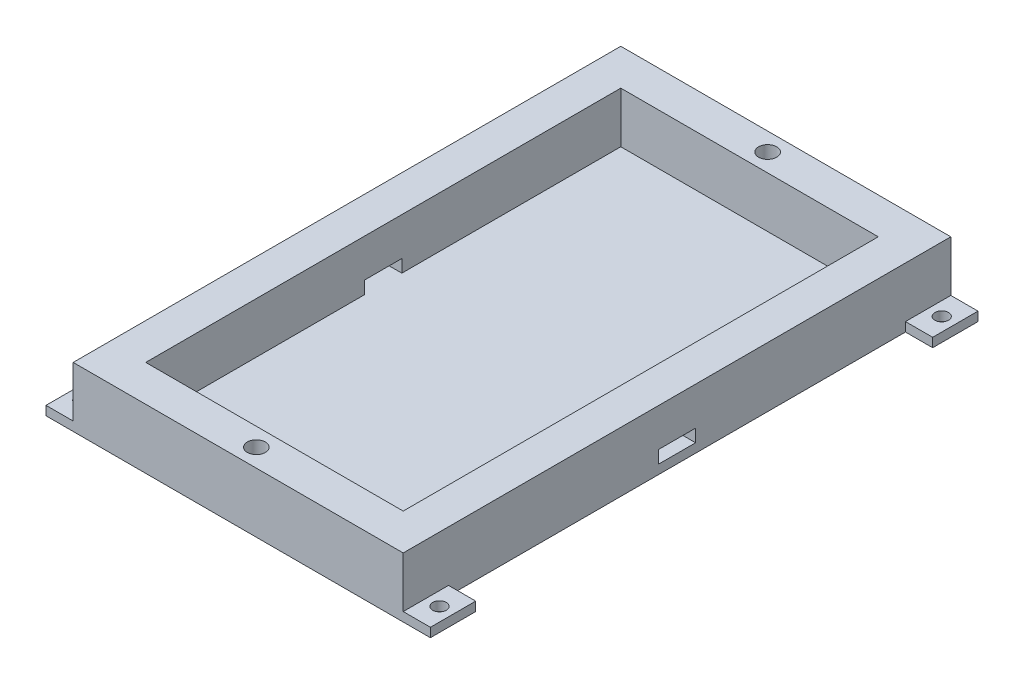
ISO-10303-21;
HEADER;
FILE_DESCRIPTION(('STEP AP214'),'2;1');
FILE_NAME('part.step','',(''),(''),'','','');
FILE_SCHEMA(('AUTOMOTIVE_DESIGN { 1 0 10303 214 1 1 1 1 }'));
ENDSEC;
DATA;
#1=APPLICATION_CONTEXT('core data for automotive mechanical design processes');
#2=APPLICATION_PROTOCOL_DEFINITION('international standard','automotive_design',2000,#1);
#3=PRODUCT_CONTEXT('',#1,'mechanical');
#4=PRODUCT('Part','Part','',(#3));
#5=PRODUCT_RELATED_PRODUCT_CATEGORY('part','',(#4));
#6=PRODUCT_DEFINITION_FORMATION('','',#4);
#7=PRODUCT_DEFINITION_CONTEXT('part definition',#1,'design');
#8=PRODUCT_DEFINITION('design','',#6,#7);
#9=PRODUCT_DEFINITION_SHAPE('','',#8);
#10=(LENGTH_UNIT() NAMED_UNIT(*) SI_UNIT(.MILLI.,.METRE.));
#11=(NAMED_UNIT(*) PLANE_ANGLE_UNIT() SI_UNIT($,.RADIAN.));
#12=(NAMED_UNIT(*) SI_UNIT($,.STERADIAN.) SOLID_ANGLE_UNIT());
#13=UNCERTAINTY_MEASURE_WITH_UNIT(LENGTH_MEASURE(1.E-05),#10,'distance_accuracy_value','');
#14=(GEOMETRIC_REPRESENTATION_CONTEXT(3) GLOBAL_UNCERTAINTY_ASSIGNED_CONTEXT((#13)) GLOBAL_UNIT_ASSIGNED_CONTEXT((#10,
#11,#12)) REPRESENTATION_CONTEXT('',''));
#15=CARTESIAN_POINT('',(0.,0.,0.));
#16=DIRECTION('',(0.,0.,1.));
#17=DIRECTION('',(1.,0.,0.));
#18=AXIS2_PLACEMENT_3D('',#15,#16,#17);
#19=CARTESIAN_POINT('',(18.2,6.6,-30.2));
#20=DIRECTION('',(-1.,0.,0.));
#21=DIRECTION('',(0.,0.,1.));
#22=AXIS2_PLACEMENT_3D('',#19,#20,#21);
#23=PLANE('',#22);
#24=DIRECTION('',(0.,0.,1.));
#25=VECTOR('',#24,1.);
#26=CARTESIAN_POINT('',(18.2,2.4,-2.05));
#27=LINE('',#26,#25);
#28=CARTESIAN_POINT('',(18.2,2.4,-2.05));
#29=VERTEX_POINT('',#28);
#30=CARTESIAN_POINT('',(18.2,2.4,2.05));
#31=VERTEX_POINT('',#30);
#32=EDGE_CURVE('E331',#29,#31,#27,.T.);
#33=ORIENTED_EDGE('',*,*,#32,.F.);
#34=DIRECTION('',(0.,1.,0.));
#35=VECTOR('',#34,1.);
#36=CARTESIAN_POINT('',(18.2,1.,-2.05));
#37=LINE('',#36,#35);
#38=CARTESIAN_POINT('',(18.2,1.,-2.05));
#39=VERTEX_POINT('',#38);
#40=EDGE_CURVE('E329',#39,#29,#37,.T.);
#41=ORIENTED_EDGE('',*,*,#40,.F.);
#42=DIRECTION('',(0.,0.,-1.));
#43=VECTOR('',#42,1.);
#44=CARTESIAN_POINT('',(18.2,1.,-2.05));
#45=LINE('',#44,#43);
#46=CARTESIAN_POINT('',(18.2,1.,2.05));
#47=VERTEX_POINT('',#46);
#48=EDGE_CURVE('E337',#47,#39,#45,.T.);
#49=ORIENTED_EDGE('',*,*,#48,.F.);
#50=DIRECTION('',(0.,-1.,0.));
#51=VECTOR('',#50,1.);
#52=CARTESIAN_POINT('',(18.2,1.,2.05));
#53=LINE('',#52,#51);
#54=EDGE_CURVE('E334',#31,#47,#53,.T.);
#55=ORIENTED_EDGE('',*,*,#54,.F.);
#56=EDGE_LOOP('',(#33,#41,#49,#55));
#57=FACE_BOUND('',#56,.T.);
#58=DIRECTION('',(0.,-1.,0.));
#59=VECTOR('',#58,1.);
#60=CARTESIAN_POINT('',(18.2,1.,-25.2));
#61=LINE('',#60,#59);
#62=CARTESIAN_POINT('',(18.2,1.,-25.2));
#63=VERTEX_POINT('',#62);
#64=CARTESIAN_POINT('',(18.2,0.,-25.2));
#65=VERTEX_POINT('',#64);
#66=EDGE_CURVE('E224',#63,#65,#61,.T.);
#67=ORIENTED_EDGE('',*,*,#66,.F.);
#68=DIRECTION('',(0.,0.,1.));
#69=VECTOR('',#68,1.);
#70=CARTESIAN_POINT('',(18.2,1.,-30.2));
#71=LINE('',#70,#69);
#72=CARTESIAN_POINT('',(18.2,1.,-30.2));
#73=VERTEX_POINT('',#72);
#74=EDGE_CURVE('E231',#73,#63,#71,.T.);
#75=ORIENTED_EDGE('',*,*,#74,.F.);
#76=DIRECTION('',(0.,-1.,0.));
#77=VECTOR('',#76,1.);
#78=CARTESIAN_POINT('',(18.2,6.6,-30.2));
#79=LINE('',#78,#77);
#80=CARTESIAN_POINT('',(18.2,6.6,-30.2));
#81=VERTEX_POINT('',#80);
#82=EDGE_CURVE('E40',#81,#73,#79,.T.);
#83=ORIENTED_EDGE('',*,*,#82,.F.);
#84=DIRECTION('',(0.,0.,-1.));
#85=VECTOR('',#84,1.);
#86=CARTESIAN_POINT('',(18.2,6.6,-30.2));
#87=LINE('',#86,#85);
#88=CARTESIAN_POINT('',(18.2,6.6,30.2));
#89=VERTEX_POINT('',#88);
#90=EDGE_CURVE('E411',#89,#81,#87,.T.);
#91=ORIENTED_EDGE('',*,*,#90,.F.);
#92=DIRECTION('',(0.,-1.,0.));
#93=VECTOR('',#92,1.);
#94=CARTESIAN_POINT('',(18.2,6.6,30.2));
#95=LINE('',#94,#93);
#96=CARTESIAN_POINT('',(18.2,1.,30.2));
#97=VERTEX_POINT('',#96);
#98=EDGE_CURVE('E421',#89,#97,#95,.T.);
#99=ORIENTED_EDGE('',*,*,#98,.T.);
#100=DIRECTION('',(0.,0.,1.));
#101=VECTOR('',#100,1.);
#102=CARTESIAN_POINT('',(18.2,1.,30.2));
#103=LINE('',#102,#101);
#104=CARTESIAN_POINT('',(18.2,1.,25.2));
#105=VERTEX_POINT('',#104);
#106=EDGE_CURVE('E257',#105,#97,#103,.T.);
#107=ORIENTED_EDGE('',*,*,#106,.F.);
#108=DIRECTION('',(0.,-1.,0.));
#109=VECTOR('',#108,1.);
#110=CARTESIAN_POINT('',(18.2,1.,25.2));
#111=LINE('',#110,#109);
#112=CARTESIAN_POINT('',(18.2,0.,25.2));
#113=VERTEX_POINT('',#112);
#114=EDGE_CURVE('E266',#105,#113,#111,.T.);
#115=ORIENTED_EDGE('',*,*,#114,.T.);
#116=DIRECTION('',(0.,0.,-1.));
#117=VECTOR('',#116,1.);
#118=CARTESIAN_POINT('',(18.2,0.,-30.2));
#119=LINE('',#118,#117);
#120=EDGE_CURVE('E244',#113,#65,#119,.T.);
#121=ORIENTED_EDGE('',*,*,#120,.T.);
#122=EDGE_LOOP('',(#67,#75,#83,#91,#99,#107,#115,#121));
#123=FACE_BOUND('',#122,.T.);
#124=ADVANCED_FACE('F33',(#57,#123),#23,.F.);
#125=CARTESIAN_POINT('',(-18.2,6.6,-30.2));
#126=DIRECTION('',(1.,0.,0.));
#127=DIRECTION('',(0.,0.,-1.));
#128=AXIS2_PLACEMENT_3D('',#125,#126,#127);
#129=PLANE('',#128);
#130=DIRECTION('',(0.,0.,-1.));
#131=VECTOR('',#130,1.);
#132=CARTESIAN_POINT('',(-18.2,1.,-30.2));
#133=LINE('',#132,#131);
#134=CARTESIAN_POINT('',(-18.2,1.,2.05));
#135=VERTEX_POINT('',#134);
#136=CARTESIAN_POINT('',(-18.2,1.,-2.05));
#137=VERTEX_POINT('',#136);
#138=EDGE_CURVE('E374',#135,#137,#133,.T.);
#139=ORIENTED_EDGE('',*,*,#138,.T.);
#140=DIRECTION('',(0.,1.,0.));
#141=VECTOR('',#140,1.);
#142=CARTESIAN_POINT('',(-18.2,6.59999999999997,-2.04999999999999));
#143=LINE('',#142,#141);
#144=CARTESIAN_POINT('',(-18.2,2.4,-2.05));
#145=VERTEX_POINT('',#144);
#146=EDGE_CURVE('E366',#137,#145,#143,.T.);
#147=ORIENTED_EDGE('',*,*,#146,.T.);
#148=DIRECTION('',(0.,0.,1.));
#149=VECTOR('',#148,1.);
#150=CARTESIAN_POINT('',(-18.2,2.40000000000001,-30.2));
#151=LINE('',#150,#149);
#152=CARTESIAN_POINT('',(-18.2,2.4,2.05));
#153=VERTEX_POINT('',#152);
#154=EDGE_CURVE('E371',#145,#153,#151,.T.);
#155=ORIENTED_EDGE('',*,*,#154,.T.);
#156=DIRECTION('',(0.,-1.,0.));
#157=VECTOR('',#156,1.);
#158=CARTESIAN_POINT('',(-18.2,6.59999999999998,2.05));
#159=LINE('',#158,#157);
#160=EDGE_CURVE('E358',#153,#135,#159,.T.);
#161=ORIENTED_EDGE('',*,*,#160,.T.);
#162=EDGE_LOOP('',(#139,#147,#155,#161));
#163=FACE_BOUND('',#162,.T.);
#164=DIRECTION('',(0.,-1.,0.));
#165=VECTOR('',#164,1.);
#166=CARTESIAN_POINT('',(-18.2,1.,25.2));
#167=LINE('',#166,#165);
#168=CARTESIAN_POINT('',(-18.2,1.,25.2));
#169=VERTEX_POINT('',#168);
#170=CARTESIAN_POINT('',(-18.2,0.,25.2));
#171=VERTEX_POINT('',#170);
#172=EDGE_CURVE('E301',#169,#171,#167,.T.);
#173=ORIENTED_EDGE('',*,*,#172,.F.);
#174=DIRECTION('',(0.,0.,-1.));
#175=VECTOR('',#174,1.);
#176=CARTESIAN_POINT('',(-18.2,1.,30.2));
#177=LINE('',#176,#175);
#178=CARTESIAN_POINT('',(-18.2,1.,30.2));
#179=VERTEX_POINT('',#178);
#180=EDGE_CURVE('E282',#179,#169,#177,.T.);
#181=ORIENTED_EDGE('',*,*,#180,.F.);
#182=DIRECTION('',(0.,-1.,0.));
#183=VECTOR('',#182,1.);
#184=CARTESIAN_POINT('',(-18.2,6.6,30.2));
#185=LINE('',#184,#183);
#186=CARTESIAN_POINT('',(-18.2,6.6,30.2));
#187=VERTEX_POINT('',#186);
#188=EDGE_CURVE('E431',#187,#179,#185,.T.);
#189=ORIENTED_EDGE('',*,*,#188,.F.);
#190=DIRECTION('',(0.,0.,1.));
#191=VECTOR('',#190,1.);
#192=CARTESIAN_POINT('',(-18.2,6.6,-30.2));
#193=LINE('',#192,#191);
#194=CARTESIAN_POINT('',(-18.2,6.6,-30.2));
#195=VERTEX_POINT('',#194);
#196=EDGE_CURVE('E417',#195,#187,#193,.T.);
#197=ORIENTED_EDGE('',*,*,#196,.F.);
#198=DIRECTION('',(0.,-1.,0.));
#199=VECTOR('',#198,1.);
#200=CARTESIAN_POINT('',(-18.2,6.6,-30.2));
#201=LINE('',#200,#199);
#202=CARTESIAN_POINT('',(-18.2,1.,-30.2));
#203=VERTEX_POINT('',#202);
#204=EDGE_CURVE('E434',#195,#203,#201,.T.);
#205=ORIENTED_EDGE('',*,*,#204,.T.);
#206=DIRECTION('',(0.,0.,-1.));
#207=VECTOR('',#206,1.);
#208=CARTESIAN_POINT('',(-18.2,1.,-30.2));
#209=LINE('',#208,#207);
#210=CARTESIAN_POINT('',(-18.2,1.,-25.2));
#211=VERTEX_POINT('',#210);
#212=EDGE_CURVE('E311',#211,#203,#209,.T.);
#213=ORIENTED_EDGE('',*,*,#212,.F.);
#214=DIRECTION('',(0.,-1.,0.));
#215=VECTOR('',#214,1.);
#216=CARTESIAN_POINT('',(-18.2,1.,-25.2));
#217=LINE('',#216,#215);
#218=CARTESIAN_POINT('',(-18.2,0.,-25.2));
#219=VERTEX_POINT('',#218);
#220=EDGE_CURVE('E320',#211,#219,#217,.T.);
#221=ORIENTED_EDGE('',*,*,#220,.T.);
#222=DIRECTION('',(0.,0.,1.));
#223=VECTOR('',#222,1.);
#224=CARTESIAN_POINT('',(-18.2,0.,-30.2));
#225=LINE('',#224,#223);
#226=EDGE_CURVE('E425',#219,#171,#225,.T.);
#227=ORIENTED_EDGE('',*,*,#226,.T.);
#228=EDGE_LOOP('',(#173,#181,#189,#197,#205,#213,#221,#227));
#229=FACE_BOUND('',#228,.T.);
#230=ADVANCED_FACE('F500',(#163,#229),#129,.F.);
#231=CARTESIAN_POINT('',(0.,6.6,0.));
#232=DIRECTION('',(0.,1.,0.));
#233=DIRECTION('',(0.,0.,1.));
#234=AXIS2_PLACEMENT_3D('',#231,#232,#233);
#235=PLANE('',#234);
#236=CARTESIAN_POINT('',(0.,6.6,-28.2));
#237=DIRECTION('',(0.,1.,0.));
#238=DIRECTION('',(0.,0.,1.));
#239=AXIS2_PLACEMENT_3D('',#236,#237,#238);
#240=CIRCLE('',#239,1.);
#241=CARTESIAN_POINT('',(0.,6.6,-27.2));
#242=VERTEX_POINT('',#241);
#243=EDGE_CURVE('E483',#242,#242,#240,.T.);
#244=ORIENTED_EDGE('',*,*,#243,.F.);
#245=EDGE_LOOP('',(#244));
#246=FACE_BOUND('',#245,.T.);
#247=CARTESIAN_POINT('',(0.,6.6,28.2));
#248=DIRECTION('',(0.,1.,0.));
#249=DIRECTION('',(0.,0.,1.));
#250=AXIS2_PLACEMENT_3D('',#247,#248,#249);
#251=CIRCLE('',#250,1.);
#252=CARTESIAN_POINT('',(0.,6.6,29.2));
#253=VERTEX_POINT('',#252);
#254=EDGE_CURVE('E477',#253,#253,#251,.T.);
#255=ORIENTED_EDGE('',*,*,#254,.F.);
#256=EDGE_LOOP('',(#255));
#257=FACE_BOUND('',#256,.T.);
#258=ORIENTED_EDGE('',*,*,#90,.T.);
#259=DIRECTION('',(-1.,0.,0.));
#260=VECTOR('',#259,1.);
#261=CARTESIAN_POINT('',(-18.2,6.6,-30.2));
#262=LINE('',#261,#260);
#263=EDGE_CURVE('E414',#81,#195,#262,.T.);
#264=ORIENTED_EDGE('',*,*,#263,.T.);
#265=ORIENTED_EDGE('',*,*,#196,.T.);
#266=DIRECTION('',(1.,0.,0.));
#267=VECTOR('',#266,1.);
#268=CARTESIAN_POINT('',(-18.2,6.6,30.2));
#269=LINE('',#268,#267);
#270=EDGE_CURVE('E419',#187,#89,#269,.T.);
#271=ORIENTED_EDGE('',*,*,#270,.T.);
#272=EDGE_LOOP('',(#258,#264,#265,#271));
#273=FACE_BOUND('',#272,.T.);
#274=DIRECTION('',(-1.,0.,0.));
#275=VECTOR('',#274,1.);
#276=CARTESIAN_POINT('',(-14.2,6.6,-26.2));
#277=LINE('',#276,#275);
#278=CARTESIAN_POINT('',(14.2,6.6,-26.2));
#279=VERTEX_POINT('',#278);
#280=CARTESIAN_POINT('',(-14.2,6.6,-26.2));
#281=VERTEX_POINT('',#280);
#282=EDGE_CURVE('E393',#279,#281,#277,.T.);
#283=ORIENTED_EDGE('',*,*,#282,.F.);
#284=DIRECTION('',(0.,0.,-1.));
#285=VECTOR('',#284,1.);
#286=CARTESIAN_POINT('',(14.2,6.6,-26.2));
#287=LINE('',#286,#285);
#288=CARTESIAN_POINT('',(14.2,6.6,26.2));
#289=VERTEX_POINT('',#288);
#290=EDGE_CURVE('E391',#289,#279,#287,.T.);
#291=ORIENTED_EDGE('',*,*,#290,.F.);
#292=DIRECTION('',(1.,0.,0.));
#293=VECTOR('',#292,1.);
#294=CARTESIAN_POINT('',(-14.2,6.6,26.2));
#295=LINE('',#294,#293);
#296=CARTESIAN_POINT('',(-14.2,6.6,26.2));
#297=VERTEX_POINT('',#296);
#298=EDGE_CURVE('E398',#297,#289,#295,.T.);
#299=ORIENTED_EDGE('',*,*,#298,.F.);
#300=DIRECTION('',(0.,0.,1.));
#301=VECTOR('',#300,1.);
#302=CARTESIAN_POINT('',(-14.2,6.6,-26.2));
#303=LINE('',#302,#301);
#304=EDGE_CURVE('E395',#281,#297,#303,.T.);
#305=ORIENTED_EDGE('',*,*,#304,.F.);
#306=EDGE_LOOP('',(#283,#291,#299,#305));
#307=FACE_BOUND('',#306,.T.);
#308=ADVANCED_FACE('F444',(#246,#257,#273,#307),#235,.T.);
#309=CARTESIAN_POINT('',(0.,0.,0.));
#310=DIRECTION('',(0.,1.,0.));
#311=DIRECTION('',(0.,0.,1.));
#312=AXIS2_PLACEMENT_3D('',#309,#310,#311);
#313=PLANE('',#312);
#314=ORIENTED_EDGE('',*,*,#120,.F.);
#315=DIRECTION('',(-1.,0.,0.));
#316=VECTOR('',#315,1.);
#317=CARTESIAN_POINT('',(18.2,0.,25.2));
#318=LINE('',#317,#316);
#319=CARTESIAN_POINT('',(21.2,0.,25.2));
#320=VERTEX_POINT('',#319);
#321=EDGE_CURVE('E47',#320,#113,#318,.T.);
#322=ORIENTED_EDGE('',*,*,#321,.F.);
#323=DIRECTION('',(0.,0.,-1.));
#324=VECTOR('',#323,1.);
#325=CARTESIAN_POINT('',(21.2,0.,30.2));
#326=LINE('',#325,#324);
#327=CARTESIAN_POINT('',(21.2,0.,30.2));
#328=VERTEX_POINT('',#327);
#329=EDGE_CURVE('E255',#328,#320,#326,.T.);
#330=ORIENTED_EDGE('',*,*,#329,.F.);
#331=DIRECTION('',(1.,0.,0.));
#332=VECTOR('',#331,1.);
#333=CARTESIAN_POINT('',(-18.2,0.,30.2));
#334=LINE('',#333,#332);
#335=CARTESIAN_POINT('',(-21.2,0.,30.2));
#336=VERTEX_POINT('',#335);
#337=EDGE_CURVE('E415',#336,#328,#334,.T.);
#338=ORIENTED_EDGE('',*,*,#337,.F.);
#339=DIRECTION('',(0.,0.,1.));
#340=VECTOR('',#339,1.);
#341=CARTESIAN_POINT('',(-21.2,0.,30.2));
#342=LINE('',#341,#340);
#343=CARTESIAN_POINT('',(-21.2,0.,25.2));
#344=VERTEX_POINT('',#343);
#345=EDGE_CURVE('E286',#344,#336,#342,.T.);
#346=ORIENTED_EDGE('',*,*,#345,.F.);
#347=DIRECTION('',(-1.,0.,0.));
#348=VECTOR('',#347,1.);
#349=CARTESIAN_POINT('',(-18.2,0.,25.2));
#350=LINE('',#349,#348);
#351=EDGE_CURVE('E279',#171,#344,#350,.T.);
#352=ORIENTED_EDGE('',*,*,#351,.F.);
#353=ORIENTED_EDGE('',*,*,#226,.F.);
#354=DIRECTION('',(1.,0.,0.));
#355=VECTOR('',#354,1.);
#356=CARTESIAN_POINT('',(-18.2,0.,-25.2));
#357=LINE('',#356,#355);
#358=CARTESIAN_POINT('',(-21.2,0.,-25.2));
#359=VERTEX_POINT('',#358);
#360=EDGE_CURVE('E55',#359,#219,#357,.T.);
#361=ORIENTED_EDGE('',*,*,#360,.F.);
#362=DIRECTION('',(0.,0.,1.));
#363=VECTOR('',#362,1.);
#364=CARTESIAN_POINT('',(-21.2,0.,-30.2));
#365=LINE('',#364,#363);
#366=CARTESIAN_POINT('',(-21.2,0.,-30.2));
#367=VERTEX_POINT('',#366);
#368=EDGE_CURVE('E308',#367,#359,#365,.T.);
#369=ORIENTED_EDGE('',*,*,#368,.F.);
#370=DIRECTION('',(-1.,0.,0.));
#371=VECTOR('',#370,1.);
#372=CARTESIAN_POINT('',(-18.2,0.,-30.2));
#373=LINE('',#372,#371);
#374=CARTESIAN_POINT('',(21.2,0.,-30.2));
#375=VERTEX_POINT('',#374);
#376=EDGE_CURVE('E423',#375,#367,#373,.T.);
#377=ORIENTED_EDGE('',*,*,#376,.F.);
#378=DIRECTION('',(0.,0.,-1.));
#379=VECTOR('',#378,1.);
#380=CARTESIAN_POINT('',(21.2,0.,-30.2));
#381=LINE('',#380,#379);
#382=CARTESIAN_POINT('',(21.2,0.,-25.2));
#383=VERTEX_POINT('',#382);
#384=EDGE_CURVE('E241',#383,#375,#381,.T.);
#385=ORIENTED_EDGE('',*,*,#384,.F.);
#386=DIRECTION('',(1.,0.,0.));
#387=VECTOR('',#386,1.);
#388=CARTESIAN_POINT('',(18.2,0.,-25.2));
#389=LINE('',#388,#387);
#390=EDGE_CURVE('E462',#65,#383,#389,.T.);
#391=ORIENTED_EDGE('',*,*,#390,.F.);
#392=EDGE_LOOP('',(#314,#322,#330,#338,#346,#352,#353,#361,#369,#377,#385,#391));
#393=FACE_BOUND('',#392,.T.);
#394=CARTESIAN_POINT('',(-19.7,0.,-27.7));
#395=DIRECTION('',(0.,1.,0.));
#396=DIRECTION('',(0.,0.,1.));
#397=AXIS2_PLACEMENT_3D('',#394,#395,#396);
#398=CIRCLE('',#397,0.750000000000002);
#399=CARTESIAN_POINT('',(-19.7,0.,-26.95));
#400=VERTEX_POINT('',#399);
#401=EDGE_CURVE('E304',#400,#400,#398,.T.);
#402=ORIENTED_EDGE('',*,*,#401,.T.);
#403=EDGE_LOOP('',(#402));
#404=FACE_BOUND('',#403,.T.);
#405=CARTESIAN_POINT('',(-19.7,0.,27.7));
#406=DIRECTION('',(0.,1.,0.));
#407=DIRECTION('',(0.,0.,1.));
#408=AXIS2_PLACEMENT_3D('',#405,#406,#407);
#409=CIRCLE('',#408,0.750000000000002);
#410=CARTESIAN_POINT('',(-19.7,0.,28.45));
#411=VERTEX_POINT('',#410);
#412=EDGE_CURVE('E275',#411,#411,#409,.T.);
#413=ORIENTED_EDGE('',*,*,#412,.T.);
#414=EDGE_LOOP('',(#413));
#415=FACE_BOUND('',#414,.T.);
#416=CARTESIAN_POINT('',(19.7,0.,27.7));
#417=DIRECTION('',(0.,1.,0.));
#418=DIRECTION('',(0.,0.,1.));
#419=AXIS2_PLACEMENT_3D('',#416,#417,#418);
#420=CIRCLE('',#419,0.750000000000002);
#421=CARTESIAN_POINT('',(19.7,0.,28.45));
#422=VERTEX_POINT('',#421);
#423=EDGE_CURVE('E245',#422,#422,#420,.T.);
#424=ORIENTED_EDGE('',*,*,#423,.T.);
#425=EDGE_LOOP('',(#424));
#426=FACE_BOUND('',#425,.T.);
#427=CARTESIAN_POINT('',(19.7,0.,-27.7));
#428=DIRECTION('',(0.,1.,0.));
#429=DIRECTION('',(0.,0.,1.));
#430=AXIS2_PLACEMENT_3D('',#427,#428,#429);
#431=CIRCLE('',#430,0.750000000000002);
#432=CARTESIAN_POINT('',(19.7,0.,-26.95));
#433=VERTEX_POINT('',#432);
#434=EDGE_CURVE('E468',#433,#433,#431,.T.);
#435=ORIENTED_EDGE('',*,*,#434,.T.);
#436=EDGE_LOOP('',(#435));
#437=FACE_BOUND('',#436,.T.);
#438=ADVANCED_FACE('F458',(#393,#404,#415,#426,#437),#313,.F.);
#439=CARTESIAN_POINT('',(-18.2,6.6,-30.2));
#440=DIRECTION('',(0.,0.,1.));
#441=DIRECTION('',(1.,0.,0.));
#442=AXIS2_PLACEMENT_3D('',#439,#440,#441);
#443=PLANE('',#442);
#444=ORIENTED_EDGE('',*,*,#376,.T.);
#445=DIRECTION('',(0.,-1.,0.));
#446=VECTOR('',#445,1.);
#447=CARTESIAN_POINT('',(-21.2,1.,-30.2));
#448=LINE('',#447,#446);
#449=CARTESIAN_POINT('',(-21.2,1.,-30.2));
#450=VERTEX_POINT('',#449);
#451=EDGE_CURVE('E326',#450,#367,#448,.T.);
#452=ORIENTED_EDGE('',*,*,#451,.F.);
#453=DIRECTION('',(-1.,0.,0.));
#454=VECTOR('',#453,1.);
#455=CARTESIAN_POINT('',(-18.2,1.,-30.2));
#456=LINE('',#455,#454);
#457=EDGE_CURVE('E314',#203,#450,#456,.T.);
#458=ORIENTED_EDGE('',*,*,#457,.F.);
#459=ORIENTED_EDGE('',*,*,#204,.F.);
#460=ORIENTED_EDGE('',*,*,#263,.F.);
#461=ORIENTED_EDGE('',*,*,#82,.T.);
#462=DIRECTION('',(-1.,0.,0.));
#463=VECTOR('',#462,1.);
#464=CARTESIAN_POINT('',(18.2,1.,-30.2));
#465=LINE('',#464,#463);
#466=CARTESIAN_POINT('',(21.2,1.,-30.2));
#467=VERTEX_POINT('',#466);
#468=EDGE_CURVE('E237',#467,#73,#465,.T.);
#469=ORIENTED_EDGE('',*,*,#468,.F.);
#470=DIRECTION('',(0.,-1.,0.));
#471=VECTOR('',#470,1.);
#472=CARTESIAN_POINT('',(21.2,1.,-30.2));
#473=LINE('',#472,#471);
#474=EDGE_CURVE('E250',#467,#375,#473,.T.);
#475=ORIENTED_EDGE('',*,*,#474,.T.);
#476=EDGE_LOOP('',(#444,#452,#458,#459,#460,#461,#469,#475));
#477=FACE_BOUND('',#476,.T.);
#478=ADVANCED_FACE('F437',(#477),#443,.F.);
#479=CARTESIAN_POINT('',(-18.2,6.6,30.2));
#480=DIRECTION('',(0.,0.,-1.));
#481=DIRECTION('',(-1.,0.,0.));
#482=AXIS2_PLACEMENT_3D('',#479,#480,#481);
#483=PLANE('',#482);
#484=ORIENTED_EDGE('',*,*,#337,.T.);
#485=DIRECTION('',(0.,-1.,0.));
#486=VECTOR('',#485,1.);
#487=CARTESIAN_POINT('',(21.2,1.,30.2));
#488=LINE('',#487,#486);
#489=CARTESIAN_POINT('',(21.2,1.,30.2));
#490=VERTEX_POINT('',#489);
#491=EDGE_CURVE('E272',#490,#328,#488,.T.);
#492=ORIENTED_EDGE('',*,*,#491,.F.);
#493=DIRECTION('',(1.,0.,0.));
#494=VECTOR('',#493,1.);
#495=CARTESIAN_POINT('',(18.2,1.,30.2));
#496=LINE('',#495,#494);
#497=EDGE_CURVE('E260',#97,#490,#496,.T.);
#498=ORIENTED_EDGE('',*,*,#497,.F.);
#499=ORIENTED_EDGE('',*,*,#98,.F.);
#500=ORIENTED_EDGE('',*,*,#270,.F.);
#501=ORIENTED_EDGE('',*,*,#188,.T.);
#502=DIRECTION('',(1.,0.,0.));
#503=VECTOR('',#502,1.);
#504=CARTESIAN_POINT('',(-18.2,1.,30.2));
#505=LINE('',#504,#503);
#506=CARTESIAN_POINT('',(-21.2,1.,30.2));
#507=VERTEX_POINT('',#506);
#508=EDGE_CURVE('E290',#507,#179,#505,.T.);
#509=ORIENTED_EDGE('',*,*,#508,.F.);
#510=DIRECTION('',(0.,-1.,0.));
#511=VECTOR('',#510,1.);
#512=CARTESIAN_POINT('',(-21.2,1.,30.2));
#513=LINE('',#512,#511);
#514=EDGE_CURVE('E292',#507,#336,#513,.T.);
#515=ORIENTED_EDGE('',*,*,#514,.T.);
#516=EDGE_LOOP('',(#484,#492,#498,#499,#500,#501,#509,#515));
#517=FACE_BOUND('',#516,.T.);
#518=ADVANCED_FACE('F450',(#517),#483,.F.);
#519=CARTESIAN_POINT('',(14.2,6.6,-26.2));
#520=DIRECTION('',(-1.,0.,0.));
#521=DIRECTION('',(0.,0.,1.));
#522=AXIS2_PLACEMENT_3D('',#519,#520,#521);
#523=PLANE('',#522);
#524=DIRECTION('',(0.,-1.,0.));
#525=VECTOR('',#524,1.);
#526=CARTESIAN_POINT('',(14.2,6.59999999999997,-2.05));
#527=LINE('',#526,#525);
#528=CARTESIAN_POINT('',(14.2,2.4,-2.05));
#529=VERTEX_POINT('',#528);
#530=CARTESIAN_POINT('',(14.2,1.,-2.05));
#531=VERTEX_POINT('',#530);
#532=EDGE_CURVE('E364',#529,#531,#527,.T.);
#533=ORIENTED_EDGE('',*,*,#532,.F.);
#534=DIRECTION('',(0.,0.,-1.));
#535=VECTOR('',#534,1.);
#536=CARTESIAN_POINT('',(14.2,2.40000000000001,-26.2));
#537=LINE('',#536,#535);
#538=CARTESIAN_POINT('',(14.2,2.4,2.05));
#539=VERTEX_POINT('',#538);
#540=EDGE_CURVE('E369',#539,#529,#537,.T.);
#541=ORIENTED_EDGE('',*,*,#540,.F.);
#542=DIRECTION('',(0.,1.,0.));
#543=VECTOR('',#542,1.);
#544=CARTESIAN_POINT('',(14.2,6.59999999999998,2.05));
#545=LINE('',#544,#543);
#546=CARTESIAN_POINT('',(14.2,1.,2.05));
#547=VERTEX_POINT('',#546);
#548=EDGE_CURVE('E355',#547,#539,#545,.T.);
#549=ORIENTED_EDGE('',*,*,#548,.F.);
#550=DIRECTION('',(0.,0.,-1.));
#551=VECTOR('',#550,1.);
#552=CARTESIAN_POINT('',(14.2,1.,26.2));
#553=LINE('',#552,#551);
#554=CARTESIAN_POINT('',(14.2,1.,26.2));
#555=VERTEX_POINT('',#554);
#556=EDGE_CURVE('E385',#555,#547,#553,.T.);
#557=ORIENTED_EDGE('',*,*,#556,.F.);
#558=DIRECTION('',(0.,-1.,0.));
#559=VECTOR('',#558,1.);
#560=CARTESIAN_POINT('',(14.2,6.6,26.2));
#561=LINE('',#560,#559);
#562=EDGE_CURVE('E400',#289,#555,#561,.T.);
#563=ORIENTED_EDGE('',*,*,#562,.F.);
#564=ORIENTED_EDGE('',*,*,#290,.T.);
#565=DIRECTION('',(0.,-1.,0.));
#566=VECTOR('',#565,1.);
#567=CARTESIAN_POINT('',(14.2,6.6,-26.2));
#568=LINE('',#567,#566);
#569=CARTESIAN_POINT('',(14.2,1.,-26.2));
#570=VERTEX_POINT('',#569);
#571=EDGE_CURVE('E408',#279,#570,#568,.T.);
#572=ORIENTED_EDGE('',*,*,#571,.T.);
#573=EDGE_CURVE('E384',#531,#570,#553,.T.);
#574=ORIENTED_EDGE('',*,*,#573,.F.);
#575=EDGE_LOOP('',(#533,#541,#549,#557,#563,#564,#572,#574));
#576=FACE_BOUND('',#575,.T.);
#577=ADVANCED_FACE('F540',(#576),#523,.T.);
#578=CARTESIAN_POINT('',(-14.2,6.6,-26.2));
#579=DIRECTION('',(0.,0.,1.));
#580=DIRECTION('',(1.,0.,0.));
#581=AXIS2_PLACEMENT_3D('',#578,#579,#580);
#582=PLANE('',#581);
#583=DIRECTION('',(-1.,0.,0.));
#584=VECTOR('',#583,1.);
#585=CARTESIAN_POINT('',(14.2,1.,-26.2));
#586=LINE('',#585,#584);
#587=CARTESIAN_POINT('',(-14.2,1.,-26.2));
#588=VERTEX_POINT('',#587);
#589=EDGE_CURVE('E388',#570,#588,#586,.T.);
#590=ORIENTED_EDGE('',*,*,#589,.F.);
#591=ORIENTED_EDGE('',*,*,#571,.F.);
#592=ORIENTED_EDGE('',*,*,#282,.T.);
#593=DIRECTION('',(0.,-1.,0.));
#594=VECTOR('',#593,1.);
#595=CARTESIAN_POINT('',(-14.2,6.6,-26.2));
#596=LINE('',#595,#594);
#597=EDGE_CURVE('E405',#281,#588,#596,.T.);
#598=ORIENTED_EDGE('',*,*,#597,.T.);
#599=EDGE_LOOP('',(#590,#591,#592,#598));
#600=FACE_BOUND('',#599,.T.);
#601=ADVANCED_FACE('F547',(#600),#582,.T.);
#602=CARTESIAN_POINT('',(-14.2,6.6,-26.2));
#603=DIRECTION('',(1.,0.,0.));
#604=DIRECTION('',(0.,0.,-1.));
#605=AXIS2_PLACEMENT_3D('',#602,#603,#604);
#606=PLANE('',#605);
#607=DIRECTION('',(0.,1.,0.));
#608=VECTOR('',#607,1.);
#609=CARTESIAN_POINT('',(-14.2,6.59999999999997,-2.04999999999999));
#610=LINE('',#609,#608);
#611=CARTESIAN_POINT('',(-14.2,1.,-2.05));
#612=VERTEX_POINT('',#611);
#613=CARTESIAN_POINT('',(-14.2,2.4,-2.05));
#614=VERTEX_POINT('',#613);
#615=EDGE_CURVE('E361',#612,#614,#610,.T.);
#616=ORIENTED_EDGE('',*,*,#615,.F.);
#617=DIRECTION('',(0.,0.,1.));
#618=VECTOR('',#617,1.);
#619=CARTESIAN_POINT('',(-14.2,1.,26.2));
#620=LINE('',#619,#618);
#621=EDGE_CURVE('E378',#588,#612,#620,.T.);
#622=ORIENTED_EDGE('',*,*,#621,.F.);
#623=ORIENTED_EDGE('',*,*,#597,.F.);
#624=ORIENTED_EDGE('',*,*,#304,.T.);
#625=DIRECTION('',(0.,-1.,0.));
#626=VECTOR('',#625,1.);
#627=CARTESIAN_POINT('',(-14.2,6.6,26.2));
#628=LINE('',#627,#626);
#629=CARTESIAN_POINT('',(-14.2,1.,26.2));
#630=VERTEX_POINT('',#629);
#631=EDGE_CURVE('E402',#297,#630,#628,.T.);
#632=ORIENTED_EDGE('',*,*,#631,.T.);
#633=CARTESIAN_POINT('',(-14.2,1.,2.05));
#634=VERTEX_POINT('',#633);
#635=EDGE_CURVE('E377',#634,#630,#620,.T.);
#636=ORIENTED_EDGE('',*,*,#635,.F.);
#637=DIRECTION('',(0.,-1.,0.));
#638=VECTOR('',#637,1.);
#639=CARTESIAN_POINT('',(-14.2,6.59999999999998,2.05));
#640=LINE('',#639,#638);
#641=CARTESIAN_POINT('',(-14.2,2.4,2.05));
#642=VERTEX_POINT('',#641);
#643=EDGE_CURVE('E353',#642,#634,#640,.T.);
#644=ORIENTED_EDGE('',*,*,#643,.F.);
#645=DIRECTION('',(0.,0.,1.));
#646=VECTOR('',#645,1.);
#647=CARTESIAN_POINT('',(-14.2,2.40000000000001,-26.2));
#648=LINE('',#647,#646);
#649=EDGE_CURVE('E11',#614,#642,#648,.T.);
#650=ORIENTED_EDGE('',*,*,#649,.F.);
#651=EDGE_LOOP('',(#616,#622,#623,#624,#632,#636,#644,#650));
#652=FACE_BOUND('',#651,.T.);
#653=ADVANCED_FACE('F553',(#652),#606,.T.);
#654=CARTESIAN_POINT('',(-14.2,6.6,26.2));
#655=DIRECTION('',(0.,0.,-1.));
#656=DIRECTION('',(-1.,0.,0.));
#657=AXIS2_PLACEMENT_3D('',#654,#655,#656);
#658=PLANE('',#657);
#659=DIRECTION('',(1.,0.,0.));
#660=VECTOR('',#659,1.);
#661=CARTESIAN_POINT('',(14.2,1.,26.2));
#662=LINE('',#661,#660);
#663=EDGE_CURVE('E381',#630,#555,#662,.T.);
#664=ORIENTED_EDGE('',*,*,#663,.F.);
#665=ORIENTED_EDGE('',*,*,#631,.F.);
#666=ORIENTED_EDGE('',*,*,#298,.T.);
#667=ORIENTED_EDGE('',*,*,#562,.T.);
#668=EDGE_LOOP('',(#664,#665,#666,#667));
#669=FACE_BOUND('',#668,.T.);
#670=ADVANCED_FACE('F559',(#669),#658,.T.);
#671=CARTESIAN_POINT('',(0.,1.,0.));
#672=DIRECTION('',(0.,1.,0.));
#673=DIRECTION('',(0.,0.,1.));
#674=AXIS2_PLACEMENT_3D('',#671,#672,#673);
#675=PLANE('',#674);
#676=ORIENTED_EDGE('',*,*,#556,.T.);
#677=DIRECTION('',(1.,0.,0.));
#678=VECTOR('',#677,1.);
#679=CARTESIAN_POINT('',(-19.8,1.,2.05));
#680=LINE('',#679,#678);
#681=EDGE_CURVE('E345',#547,#47,#680,.T.);
#682=ORIENTED_EDGE('',*,*,#681,.T.);
#683=ORIENTED_EDGE('',*,*,#48,.T.);
#684=DIRECTION('',(1.,0.,0.));
#685=VECTOR('',#684,1.);
#686=CARTESIAN_POINT('',(-19.8,1.,-2.05));
#687=LINE('',#686,#685);
#688=EDGE_CURVE('E341',#531,#39,#687,.T.);
#689=ORIENTED_EDGE('',*,*,#688,.F.);
#690=ORIENTED_EDGE('',*,*,#573,.T.);
#691=ORIENTED_EDGE('',*,*,#589,.T.);
#692=ORIENTED_EDGE('',*,*,#621,.T.);
#693=EDGE_CURVE('E343',#137,#612,#687,.T.);
#694=ORIENTED_EDGE('',*,*,#693,.F.);
#695=ORIENTED_EDGE('',*,*,#138,.F.);
#696=EDGE_CURVE('E344',#135,#634,#680,.T.);
#697=ORIENTED_EDGE('',*,*,#696,.T.);
#698=ORIENTED_EDGE('',*,*,#635,.T.);
#699=ORIENTED_EDGE('',*,*,#663,.T.);
#700=EDGE_LOOP('',(#676,#682,#683,#689,#690,#691,#692,#694,#695,#697,#698,#699));
#701=FACE_BOUND('',#700,.T.);
#702=ADVANCED_FACE('F545',(#701),#675,.T.);
#703=CARTESIAN_POINT('',(-19.8,2.4,-2.05));
#704=DIRECTION('',(0.,1.,0.));
#705=DIRECTION('',(0.,0.,1.));
#706=AXIS2_PLACEMENT_3D('',#703,#704,#705);
#707=PLANE('',#706);
#708=DIRECTION('',(1.,0.,0.));
#709=VECTOR('',#708,1.);
#710=CARTESIAN_POINT('',(-19.8,2.4,-2.05));
#711=LINE('',#710,#709);
#712=EDGE_CURVE('E350',#145,#614,#711,.T.);
#713=ORIENTED_EDGE('',*,*,#712,.T.);
#714=ORIENTED_EDGE('',*,*,#649,.T.);
#715=DIRECTION('',(1.,0.,0.));
#716=VECTOR('',#715,1.);
#717=CARTESIAN_POINT('',(-19.8,2.4,2.05));
#718=LINE('',#717,#716);
#719=EDGE_CURVE('E347',#153,#642,#718,.T.);
#720=ORIENTED_EDGE('',*,*,#719,.F.);
#721=ORIENTED_EDGE('',*,*,#154,.F.);
#722=EDGE_LOOP('',(#713,#714,#720,#721));
#723=FACE_BOUND('',#722,.T.);
#724=ADVANCED_FACE('F574',(#723),#707,.F.);
#725=CARTESIAN_POINT('',(-19.8,1.,2.05));
#726=DIRECTION('',(0.,0.,1.));
#727=DIRECTION('',(0.,-1.,0.));
#728=AXIS2_PLACEMENT_3D('',#725,#726,#727);
#729=PLANE('',#728);
#730=ORIENTED_EDGE('',*,*,#719,.T.);
#731=ORIENTED_EDGE('',*,*,#643,.T.);
#732=ORIENTED_EDGE('',*,*,#696,.F.);
#733=ORIENTED_EDGE('',*,*,#160,.F.);
#734=EDGE_LOOP('',(#730,#731,#732,#733));
#735=FACE_BOUND('',#734,.T.);
#736=ADVANCED_FACE('F568',(#735),#729,.F.);
#737=CARTESIAN_POINT('',(-19.8,1.,-2.05));
#738=DIRECTION('',(0.,0.,-1.));
#739=DIRECTION('',(0.,1.,0.));
#740=AXIS2_PLACEMENT_3D('',#737,#738,#739);
#741=PLANE('',#740);
#742=ORIENTED_EDGE('',*,*,#693,.T.);
#743=ORIENTED_EDGE('',*,*,#615,.T.);
#744=ORIENTED_EDGE('',*,*,#712,.F.);
#745=ORIENTED_EDGE('',*,*,#146,.F.);
#746=EDGE_LOOP('',(#742,#743,#744,#745));
#747=FACE_BOUND('',#746,.T.);
#748=ADVANCED_FACE('F576',(#747),#741,.F.);
#749=ORIENTED_EDGE('',*,*,#540,.T.);
#750=EDGE_CURVE('E340',#529,#29,#711,.T.);
#751=ORIENTED_EDGE('',*,*,#750,.T.);
#752=ORIENTED_EDGE('',*,*,#32,.T.);
#753=EDGE_CURVE('E348',#539,#31,#718,.T.);
#754=ORIENTED_EDGE('',*,*,#753,.F.);
#755=EDGE_LOOP('',(#749,#751,#752,#754));
#756=FACE_BOUND('',#755,.T.);
#757=ADVANCED_FACE('F531',(#756),#707,.F.);
#758=ORIENTED_EDGE('',*,*,#532,.T.);
#759=ORIENTED_EDGE('',*,*,#688,.T.);
#760=ORIENTED_EDGE('',*,*,#40,.T.);
#761=ORIENTED_EDGE('',*,*,#750,.F.);
#762=EDGE_LOOP('',(#758,#759,#760,#761));
#763=FACE_BOUND('',#762,.T.);
#764=ADVANCED_FACE('F536',(#763),#741,.F.);
#765=ORIENTED_EDGE('',*,*,#548,.T.);
#766=ORIENTED_EDGE('',*,*,#753,.T.);
#767=ORIENTED_EDGE('',*,*,#54,.T.);
#768=ORIENTED_EDGE('',*,*,#681,.F.);
#769=EDGE_LOOP('',(#765,#766,#767,#768));
#770=FACE_BOUND('',#769,.T.);
#771=ADVANCED_FACE('F585',(#770),#729,.F.);
#772=CARTESIAN_POINT('',(0.,1.,0.));
#773=DIRECTION('',(0.,-1.,0.));
#774=DIRECTION('',(0.,0.,-1.));
#775=AXIS2_PLACEMENT_3D('',#772,#773,#774);
#776=PLANE('',#775);
#777=ORIENTED_EDGE('',*,*,#212,.T.);
#778=ORIENTED_EDGE('',*,*,#457,.T.);
#779=DIRECTION('',(0.,0.,1.));
#780=VECTOR('',#779,1.);
#781=CARTESIAN_POINT('',(-21.2,1.,-30.2));
#782=LINE('',#781,#780);
#783=CARTESIAN_POINT('',(-21.2,1.,-25.2));
#784=VERTEX_POINT('',#783);
#785=EDGE_CURVE('E316',#450,#784,#782,.T.);
#786=ORIENTED_EDGE('',*,*,#785,.T.);
#787=DIRECTION('',(1.,0.,0.));
#788=VECTOR('',#787,1.);
#789=CARTESIAN_POINT('',(-18.2,1.,-25.2));
#790=LINE('',#789,#788);
#791=EDGE_CURVE('E318',#784,#211,#790,.T.);
#792=ORIENTED_EDGE('',*,*,#791,.T.);
#793=EDGE_LOOP('',(#777,#778,#786,#792));
#794=FACE_BOUND('',#793,.T.);
#795=CARTESIAN_POINT('',(-19.7,1.,-27.7));
#796=DIRECTION('',(0.,1.,0.));
#797=DIRECTION('',(0.,0.,1.));
#798=AXIS2_PLACEMENT_3D('',#795,#796,#797);
#799=CIRCLE('',#798,0.750000000000002);
#800=CARTESIAN_POINT('',(-19.7,1.,-26.95));
#801=VERTEX_POINT('',#800);
#802=EDGE_CURVE('E305',#801,#801,#799,.T.);
#803=ORIENTED_EDGE('',*,*,#802,.F.);
#804=EDGE_LOOP('',(#803));
#805=FACE_BOUND('',#804,.T.);
#806=ADVANCED_FACE('F591',(#794,#805),#776,.F.);
#807=CARTESIAN_POINT('',(-21.2,1.,-30.2));
#808=DIRECTION('',(1.,0.,0.));
#809=DIRECTION('',(0.,0.,-1.));
#810=AXIS2_PLACEMENT_3D('',#807,#808,#809);
#811=PLANE('',#810);
#812=ORIENTED_EDGE('',*,*,#368,.T.);
#813=DIRECTION('',(0.,-1.,0.));
#814=VECTOR('',#813,1.);
#815=CARTESIAN_POINT('',(-21.2,1.,-25.2));
#816=LINE('',#815,#814);
#817=EDGE_CURVE('E324',#784,#359,#816,.T.);
#818=ORIENTED_EDGE('',*,*,#817,.F.);
#819=ORIENTED_EDGE('',*,*,#785,.F.);
#820=ORIENTED_EDGE('',*,*,#451,.T.);
#821=EDGE_LOOP('',(#812,#818,#819,#820));
#822=FACE_BOUND('',#821,.T.);
#823=ADVANCED_FACE('F596',(#822),#811,.F.);
#824=CARTESIAN_POINT('',(-18.2,1.,-25.2));
#825=DIRECTION('',(0.,0.,-1.));
#826=DIRECTION('',(-1.,0.,0.));
#827=AXIS2_PLACEMENT_3D('',#824,#825,#826);
#828=PLANE('',#827);
#829=ORIENTED_EDGE('',*,*,#360,.T.);
#830=ORIENTED_EDGE('',*,*,#220,.F.);
#831=ORIENTED_EDGE('',*,*,#791,.F.);
#832=ORIENTED_EDGE('',*,*,#817,.T.);
#833=EDGE_LOOP('',(#829,#830,#831,#832));
#834=FACE_BOUND('',#833,.T.);
#835=ADVANCED_FACE('F738',(#834),#828,.F.);
#836=CARTESIAN_POINT('',(-19.7,1.,-27.7));
#837=DIRECTION('',(0.,-1.,0.));
#838=DIRECTION('',(0.,0.,-1.));
#839=AXIS2_PLACEMENT_3D('',#836,#837,#838);
#840=CYLINDRICAL_SURFACE('',#839,0.750000000000002);
#841=ORIENTED_EDGE('',*,*,#802,.T.);
#842=EDGE_LOOP('',(#841));
#843=FACE_BOUND('',#842,.T.);
#844=ORIENTED_EDGE('',*,*,#401,.F.);
#845=EDGE_LOOP('',(#844));
#846=FACE_BOUND('',#845,.T.);
#847=ADVANCED_FACE('F746',(#843,#846),#840,.F.);
#848=CARTESIAN_POINT('',(0.,1.,0.));
#849=DIRECTION('',(0.,1.,0.));
#850=DIRECTION('',(0.,0.,1.));
#851=AXIS2_PLACEMENT_3D('',#848,#849,#850);
#852=PLANE('',#851);
#853=ORIENTED_EDGE('',*,*,#180,.T.);
#854=DIRECTION('',(-1.,0.,0.));
#855=VECTOR('',#854,1.);
#856=CARTESIAN_POINT('',(-18.2,1.,25.2));
#857=LINE('',#856,#855);
#858=CARTESIAN_POINT('',(-21.2,1.,25.2));
#859=VERTEX_POINT('',#858);
#860=EDGE_CURVE('E285',#169,#859,#857,.T.);
#861=ORIENTED_EDGE('',*,*,#860,.T.);
#862=DIRECTION('',(0.,0.,1.));
#863=VECTOR('',#862,1.);
#864=CARTESIAN_POINT('',(-21.2,1.,30.2));
#865=LINE('',#864,#863);
#866=EDGE_CURVE('E288',#859,#507,#865,.T.);
#867=ORIENTED_EDGE('',*,*,#866,.T.);
#868=ORIENTED_EDGE('',*,*,#508,.T.);
#869=EDGE_LOOP('',(#853,#861,#867,#868));
#870=FACE_BOUND('',#869,.T.);
#871=CARTESIAN_POINT('',(-19.7,1.,27.7));
#872=DIRECTION('',(0.,1.,0.));
#873=DIRECTION('',(0.,0.,1.));
#874=AXIS2_PLACEMENT_3D('',#871,#872,#873);
#875=CIRCLE('',#874,0.750000000000002);
#876=CARTESIAN_POINT('',(-19.7,1.,28.45));
#877=VERTEX_POINT('',#876);
#878=EDGE_CURVE('E276',#877,#877,#875,.T.);
#879=ORIENTED_EDGE('',*,*,#878,.F.);
#880=EDGE_LOOP('',(#879));
#881=FACE_BOUND('',#880,.T.);
#882=ADVANCED_FACE('F753',(#870,#881),#852,.T.);
#883=CARTESIAN_POINT('',(-18.2,1.,25.2));
#884=DIRECTION('',(0.,0.,1.));
#885=DIRECTION('',(1.,0.,0.));
#886=AXIS2_PLACEMENT_3D('',#883,#884,#885);
#887=PLANE('',#886);
#888=ORIENTED_EDGE('',*,*,#351,.T.);
#889=DIRECTION('',(0.,-1.,0.));
#890=VECTOR('',#889,1.);
#891=CARTESIAN_POINT('',(-21.2,1.,25.2));
#892=LINE('',#891,#890);
#893=EDGE_CURVE('E298',#859,#344,#892,.T.);
#894=ORIENTED_EDGE('',*,*,#893,.F.);
#895=ORIENTED_EDGE('',*,*,#860,.F.);
#896=ORIENTED_EDGE('',*,*,#172,.T.);
#897=EDGE_LOOP('',(#888,#894,#895,#896));
#898=FACE_BOUND('',#897,.T.);
#899=ADVANCED_FACE('F762',(#898),#887,.F.);
#900=CARTESIAN_POINT('',(-21.2,1.,30.2));
#901=DIRECTION('',(1.,0.,0.));
#902=DIRECTION('',(0.,0.,-1.));
#903=AXIS2_PLACEMENT_3D('',#900,#901,#902);
#904=PLANE('',#903);
#905=ORIENTED_EDGE('',*,*,#345,.T.);
#906=ORIENTED_EDGE('',*,*,#514,.F.);
#907=ORIENTED_EDGE('',*,*,#866,.F.);
#908=ORIENTED_EDGE('',*,*,#893,.T.);
#909=EDGE_LOOP('',(#905,#906,#907,#908));
#910=FACE_BOUND('',#909,.T.);
#911=ADVANCED_FACE('F771',(#910),#904,.F.);
#912=CARTESIAN_POINT('',(-19.7,1.,27.7));
#913=DIRECTION('',(0.,-1.,0.));
#914=DIRECTION('',(0.,0.,-1.));
#915=AXIS2_PLACEMENT_3D('',#912,#913,#914);
#916=CYLINDRICAL_SURFACE('',#915,0.750000000000002);
#917=ORIENTED_EDGE('',*,*,#878,.T.);
#918=EDGE_LOOP('',(#917));
#919=FACE_BOUND('',#918,.T.);
#920=ORIENTED_EDGE('',*,*,#412,.F.);
#921=EDGE_LOOP('',(#920));
#922=FACE_BOUND('',#921,.T.);
#923=ADVANCED_FACE('F780',(#919,#922),#916,.F.);
#924=CARTESIAN_POINT('',(0.,1.,0.));
#925=DIRECTION('',(0.,-1.,0.));
#926=DIRECTION('',(0.,0.,-1.));
#927=AXIS2_PLACEMENT_3D('',#924,#925,#926);
#928=PLANE('',#927);
#929=ORIENTED_EDGE('',*,*,#106,.T.);
#930=ORIENTED_EDGE('',*,*,#497,.T.);
#931=DIRECTION('',(0.,0.,-1.));
#932=VECTOR('',#931,1.);
#933=CARTESIAN_POINT('',(21.2,1.,30.2));
#934=LINE('',#933,#932);
#935=CARTESIAN_POINT('',(21.2,1.,25.2));
#936=VERTEX_POINT('',#935);
#937=EDGE_CURVE('E262',#490,#936,#934,.T.);
#938=ORIENTED_EDGE('',*,*,#937,.T.);
#939=DIRECTION('',(-1.,0.,0.));
#940=VECTOR('',#939,1.);
#941=CARTESIAN_POINT('',(18.2,1.,25.2));
#942=LINE('',#941,#940);
#943=EDGE_CURVE('E264',#936,#105,#942,.T.);
#944=ORIENTED_EDGE('',*,*,#943,.T.);
#945=EDGE_LOOP('',(#929,#930,#938,#944));
#946=FACE_BOUND('',#945,.T.);
#947=CARTESIAN_POINT('',(19.7,1.,27.7));
#948=DIRECTION('',(0.,1.,0.));
#949=DIRECTION('',(0.,0.,1.));
#950=AXIS2_PLACEMENT_3D('',#947,#948,#949);
#951=CIRCLE('',#950,0.750000000000002);
#952=CARTESIAN_POINT('',(19.7,1.,28.45));
#953=VERTEX_POINT('',#952);
#954=EDGE_CURVE('E248',#953,#953,#951,.T.);
#955=ORIENTED_EDGE('',*,*,#954,.F.);
#956=EDGE_LOOP('',(#955));
#957=FACE_BOUND('',#956,.T.);
#958=ADVANCED_FACE('F454',(#946,#957),#928,.F.);
#959=CARTESIAN_POINT('',(21.2,1.,30.2));
#960=DIRECTION('',(-1.,0.,0.));
#961=DIRECTION('',(0.,0.,1.));
#962=AXIS2_PLACEMENT_3D('',#959,#960,#961);
#963=PLANE('',#962);
#964=ORIENTED_EDGE('',*,*,#329,.T.);
#965=DIRECTION('',(0.,-1.,0.));
#966=VECTOR('',#965,1.);
#967=CARTESIAN_POINT('',(21.2,1.,25.2));
#968=LINE('',#967,#966);
#969=EDGE_CURVE('E270',#936,#320,#968,.T.);
#970=ORIENTED_EDGE('',*,*,#969,.F.);
#971=ORIENTED_EDGE('',*,*,#937,.F.);
#972=ORIENTED_EDGE('',*,*,#491,.T.);
#973=EDGE_LOOP('',(#964,#970,#971,#972));
#974=FACE_BOUND('',#973,.T.);
#975=ADVANCED_FACE('F797',(#974),#963,.F.);
#976=CARTESIAN_POINT('',(18.2,1.,25.2));
#977=DIRECTION('',(0.,0.,1.));
#978=DIRECTION('',(1.,0.,0.));
#979=AXIS2_PLACEMENT_3D('',#976,#977,#978);
#980=PLANE('',#979);
#981=ORIENTED_EDGE('',*,*,#321,.T.);
#982=ORIENTED_EDGE('',*,*,#114,.F.);
#983=ORIENTED_EDGE('',*,*,#943,.F.);
#984=ORIENTED_EDGE('',*,*,#969,.T.);
#985=EDGE_LOOP('',(#981,#982,#983,#984));
#986=FACE_BOUND('',#985,.T.);
#987=ADVANCED_FACE('F805',(#986),#980,.F.);
#988=CARTESIAN_POINT('',(19.7,1.,27.7));
#989=DIRECTION('',(0.,-1.,0.));
#990=DIRECTION('',(0.,0.,-1.));
#991=AXIS2_PLACEMENT_3D('',#988,#989,#990);
#992=CYLINDRICAL_SURFACE('',#991,0.750000000000002);
#993=ORIENTED_EDGE('',*,*,#954,.T.);
#994=EDGE_LOOP('',(#993));
#995=FACE_BOUND('',#994,.T.);
#996=ORIENTED_EDGE('',*,*,#423,.F.);
#997=EDGE_LOOP('',(#996));
#998=FACE_BOUND('',#997,.T.);
#999=ADVANCED_FACE('F814',(#995,#998),#992,.F.);
#1000=CARTESIAN_POINT('',(0.,1.,0.));
#1001=DIRECTION('',(0.,1.,0.));
#1002=DIRECTION('',(0.,0.,1.));
#1003=AXIS2_PLACEMENT_3D('',#1000,#1001,#1002);
#1004=PLANE('',#1003);
#1005=ORIENTED_EDGE('',*,*,#74,.T.);
#1006=DIRECTION('',(1.,0.,0.));
#1007=VECTOR('',#1006,1.);
#1008=CARTESIAN_POINT('',(18.2,1.,-25.2));
#1009=LINE('',#1008,#1007);
#1010=CARTESIAN_POINT('',(21.2,1.,-25.2));
#1011=VERTEX_POINT('',#1010);
#1012=EDGE_CURVE('E220',#63,#1011,#1009,.T.);
#1013=ORIENTED_EDGE('',*,*,#1012,.T.);
#1014=DIRECTION('',(0.,0.,-1.));
#1015=VECTOR('',#1014,1.);
#1016=CARTESIAN_POINT('',(21.2,1.,-30.2));
#1017=LINE('',#1016,#1015);
#1018=EDGE_CURVE('E230',#1011,#467,#1017,.T.);
#1019=ORIENTED_EDGE('',*,*,#1018,.T.);
#1020=ORIENTED_EDGE('',*,*,#468,.T.);
#1021=EDGE_LOOP('',(#1005,#1013,#1019,#1020));
#1022=FACE_BOUND('',#1021,.T.);
#1023=CARTESIAN_POINT('',(19.7,1.,-27.7));
#1024=DIRECTION('',(0.,1.,0.));
#1025=DIRECTION('',(0.,0.,1.));
#1026=AXIS2_PLACEMENT_3D('',#1023,#1024,#1025);
#1027=CIRCLE('',#1026,0.750000000000002);
#1028=CARTESIAN_POINT('',(19.7,1.,-26.95));
#1029=VERTEX_POINT('',#1028);
#1030=EDGE_CURVE('E464',#1029,#1029,#1027,.T.);
#1031=ORIENTED_EDGE('',*,*,#1030,.F.);
#1032=EDGE_LOOP('',(#1031));
#1033=FACE_BOUND('',#1032,.T.);
#1034=ADVANCED_FACE('F234',(#1022,#1033),#1004,.T.);
#1035=CARTESIAN_POINT('',(18.2,1.,-25.2));
#1036=DIRECTION('',(0.,0.,-1.));
#1037=DIRECTION('',(-1.,0.,0.));
#1038=AXIS2_PLACEMENT_3D('',#1035,#1036,#1037);
#1039=PLANE('',#1038);
#1040=ORIENTED_EDGE('',*,*,#390,.T.);
#1041=DIRECTION('',(0.,-1.,0.));
#1042=VECTOR('',#1041,1.);
#1043=CARTESIAN_POINT('',(21.2,1.,-25.2));
#1044=LINE('',#1043,#1042);
#1045=EDGE_CURVE('E227',#1011,#383,#1044,.T.);
#1046=ORIENTED_EDGE('',*,*,#1045,.F.);
#1047=ORIENTED_EDGE('',*,*,#1012,.F.);
#1048=ORIENTED_EDGE('',*,*,#66,.T.);
#1049=EDGE_LOOP('',(#1040,#1046,#1047,#1048));
#1050=FACE_BOUND('',#1049,.T.);
#1051=ADVANCED_FACE('F222',(#1050),#1039,.F.);
#1052=CARTESIAN_POINT('',(21.2,1.,-30.2));
#1053=DIRECTION('',(-1.,0.,0.));
#1054=DIRECTION('',(0.,0.,1.));
#1055=AXIS2_PLACEMENT_3D('',#1052,#1053,#1054);
#1056=PLANE('',#1055);
#1057=ORIENTED_EDGE('',*,*,#384,.T.);
#1058=ORIENTED_EDGE('',*,*,#474,.F.);
#1059=ORIENTED_EDGE('',*,*,#1018,.F.);
#1060=ORIENTED_EDGE('',*,*,#1045,.T.);
#1061=EDGE_LOOP('',(#1057,#1058,#1059,#1060));
#1062=FACE_BOUND('',#1061,.T.);
#1063=ADVANCED_FACE('F515',(#1062),#1056,.F.);
#1064=CARTESIAN_POINT('',(19.7,1.,-27.7));
#1065=DIRECTION('',(0.,-1.,0.));
#1066=DIRECTION('',(0.,0.,-1.));
#1067=AXIS2_PLACEMENT_3D('',#1064,#1065,#1066);
#1068=CYLINDRICAL_SURFACE('',#1067,0.750000000000002);
#1069=ORIENTED_EDGE('',*,*,#1030,.T.);
#1070=EDGE_LOOP('',(#1069));
#1071=FACE_BOUND('',#1070,.T.);
#1072=ORIENTED_EDGE('',*,*,#434,.F.);
#1073=EDGE_LOOP('',(#1072));
#1074=FACE_BOUND('',#1073,.T.);
#1075=ADVANCED_FACE('F506',(#1071,#1074),#1068,.F.);
#1076=CARTESIAN_POINT('',(0.,2.6,28.2));
#1077=DIRECTION('',(0.,1.,0.));
#1078=DIRECTION('',(0.,0.,1.));
#1079=AXIS2_PLACEMENT_3D('',#1076,#1077,#1078);
#1080=CYLINDRICAL_SURFACE('',#1079,1.);
#1081=CARTESIAN_POINT('',(0.,2.6,28.2));
#1082=DIRECTION('',(0.,1.,0.));
#1083=DIRECTION('',(0.,0.,1.));
#1084=AXIS2_PLACEMENT_3D('',#1081,#1082,#1083);
#1085=CIRCLE('',#1084,1.);
#1086=CARTESIAN_POINT('',(0.,2.6,29.2));
#1087=VERTEX_POINT('',#1086);
#1088=EDGE_CURVE('E480',#1087,#1087,#1085,.T.);
#1089=ORIENTED_EDGE('',*,*,#1088,.F.);
#1090=EDGE_LOOP('',(#1089));
#1091=FACE_BOUND('',#1090,.T.);
#1092=ORIENTED_EDGE('',*,*,#254,.T.);
#1093=EDGE_LOOP('',(#1092));
#1094=FACE_BOUND('',#1093,.T.);
#1095=ADVANCED_FACE('F504',(#1091,#1094),#1080,.F.);
#1096=CARTESIAN_POINT('',(0.,2.6,28.2));
#1097=DIRECTION('',(0.,1.,0.));
#1098=DIRECTION('',(0.,0.,1.));
#1099=AXIS2_PLACEMENT_3D('',#1096,#1097,#1098);
#1100=PLANE('',#1099);
#1101=ORIENTED_EDGE('',*,*,#1088,.T.);
#1102=EDGE_LOOP('',(#1101));
#1103=FACE_BOUND('',#1102,.T.);
#1104=ADVANCED_FACE('F494',(#1103),#1100,.T.);
#1105=CARTESIAN_POINT('',(0.,2.6,-28.2));
#1106=DIRECTION('',(0.,1.,0.));
#1107=DIRECTION('',(0.,0.,1.));
#1108=AXIS2_PLACEMENT_3D('',#1105,#1106,#1107);
#1109=CYLINDRICAL_SURFACE('',#1108,1.);
#1110=CARTESIAN_POINT('',(0.,2.6,-28.2));
#1111=DIRECTION('',(0.,1.,0.));
#1112=DIRECTION('',(0.,0.,1.));
#1113=AXIS2_PLACEMENT_3D('',#1110,#1111,#1112);
#1114=CIRCLE('',#1113,1.);
#1115=CARTESIAN_POINT('',(0.,2.6,-27.2));
#1116=VERTEX_POINT('',#1115);
#1117=EDGE_CURVE('E475',#1116,#1116,#1114,.T.);
#1118=ORIENTED_EDGE('',*,*,#1117,.F.);
#1119=EDGE_LOOP('',(#1118));
#1120=FACE_BOUND('',#1119,.T.);
#1121=ORIENTED_EDGE('',*,*,#243,.T.);
#1122=EDGE_LOOP('',(#1121));
#1123=FACE_BOUND('',#1122,.T.);
#1124=ADVANCED_FACE('F491',(#1120,#1123),#1109,.F.);
#1125=CARTESIAN_POINT('',(0.,2.6,-28.2));
#1126=DIRECTION('',(0.,1.,0.));
#1127=DIRECTION('',(0.,0.,1.));
#1128=AXIS2_PLACEMENT_3D('',#1125,#1126,#1127);
#1129=PLANE('',#1128);
#1130=ORIENTED_EDGE('',*,*,#1117,.T.);
#1131=EDGE_LOOP('',(#1130));
#1132=FACE_BOUND('',#1131,.T.);
#1133=ADVANCED_FACE('F489',(#1132),#1129,.T.);
#1134=CLOSED_SHELL('',(#124,#230,#308,#438,#478,#518,#577,#601,#653,#670,#702,#724,#736,#748,
#757,#764,#771,#806,#823,#835,#847,#882,#899,#911,#923,#958,#975,#987,#999,#1034,#1051,#1063,
#1075,#1095,#1104,#1124,#1133));
#1135=MANIFOLD_SOLID_BREP('B2',#1134);
#1136=ADVANCED_BREP_SHAPE_REPRESENTATION('',(#18,#1135),#14);
#1137=SHAPE_DEFINITION_REPRESENTATION(#9,#1136);
ENDSEC;
END-ISO-10303-21;
